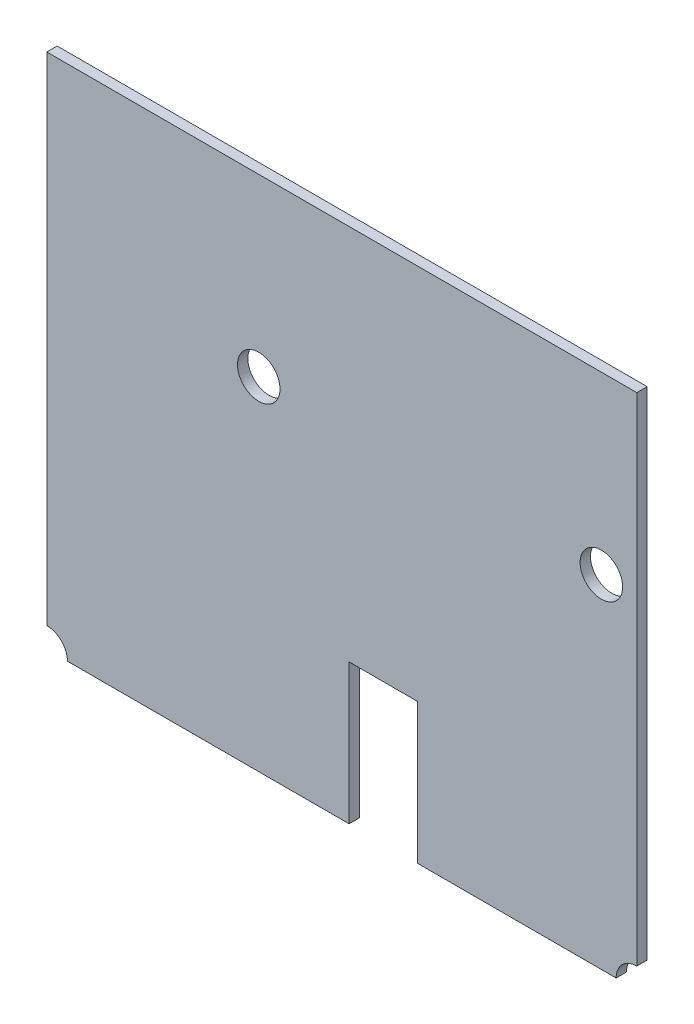
ISO-10303-21;
HEADER;
FILE_DESCRIPTION(('STEP AP214'),'2;1');
FILE_NAME('part.step','',(''),(''),'','','');
FILE_SCHEMA(('AUTOMOTIVE_DESIGN { 1 0 10303 214 1 1 1 1 }'));
ENDSEC;
DATA;
#1=APPLICATION_CONTEXT('core data for automotive mechanical design processes');
#2=APPLICATION_PROTOCOL_DEFINITION('international standard','automotive_design',2000,#1);
#3=PRODUCT_CONTEXT('',#1,'mechanical');
#4=PRODUCT('Part','Part','',(#3));
#5=PRODUCT_RELATED_PRODUCT_CATEGORY('part','',(#4));
#6=PRODUCT_DEFINITION_FORMATION('','',#4);
#7=PRODUCT_DEFINITION_CONTEXT('part definition',#1,'design');
#8=PRODUCT_DEFINITION('design','',#6,#7);
#9=PRODUCT_DEFINITION_SHAPE('','',#8);
#10=(LENGTH_UNIT() NAMED_UNIT(*) SI_UNIT(.MILLI.,.METRE.));
#11=(NAMED_UNIT(*) PLANE_ANGLE_UNIT() SI_UNIT($,.RADIAN.));
#12=(NAMED_UNIT(*) SI_UNIT($,.STERADIAN.) SOLID_ANGLE_UNIT());
#13=UNCERTAINTY_MEASURE_WITH_UNIT(LENGTH_MEASURE(1.E-05),#10,'distance_accuracy_value','');
#14=(GEOMETRIC_REPRESENTATION_CONTEXT(3) GLOBAL_UNCERTAINTY_ASSIGNED_CONTEXT((#13)) GLOBAL_UNIT_ASSIGNED_CONTEXT((#10,
#11,#12)) REPRESENTATION_CONTEXT('',''));
#15=CARTESIAN_POINT('',(0.,0.,0.));
#16=DIRECTION('',(0.,0.,1.));
#17=DIRECTION('',(1.,0.,0.));
#18=AXIS2_PLACEMENT_3D('',#15,#16,#17);
#19=CARTESIAN_POINT('',(2606.04,-2617.90434,1.));
#20=DIRECTION('',(0.,0.,-1.));
#21=DIRECTION('',(-1.,0.,0.));
#22=AXIS2_PLACEMENT_3D('',#19,#20,#21);
#23=PLANE('',#22);
#24=CARTESIAN_POINT('',(2606.04,-2617.90434,1.));
#25=DIRECTION('',(0.,0.,-1.));
#26=DIRECTION('',(-1.,0.,0.));
#27=AXIS2_PLACEMENT_3D('',#24,#25,#26);
#28=CIRCLE('',#27,1.99054720000014);
#29=CARTESIAN_POINT('',(2606.04,-2615.9137928,1.));
#30=VERTEX_POINT('',#29);
#31=CARTESIAN_POINT('',(2608.0305472,-2617.90434,1.));
#32=VERTEX_POINT('',#31);
#33=EDGE_CURVE('E175',#30,#32,#28,.T.);
#34=ORIENTED_EDGE('',*,*,#33,.T.);
#35=DIRECTION('',(1.,0.,0.));
#36=VECTOR('',#35,1.);
#37=CARTESIAN_POINT('',(2608.0305472,-2617.90434,1.));
#38=LINE('',#37,#36);
#39=CARTESIAN_POINT('',(2635.23603,-2617.90434,1.));
#40=VERTEX_POINT('',#39);
#41=EDGE_CURVE('E113',#32,#40,#38,.T.);
#42=ORIENTED_EDGE('',*,*,#41,.T.);
#43=DIRECTION('',(0.,1.,0.));
#44=VECTOR('',#43,1.);
#45=CARTESIAN_POINT('',(2635.23603,-2617.90434,1.));
#46=LINE('',#45,#44);
#47=CARTESIAN_POINT('',(2635.23603,-2604.35979,1.));
#48=VERTEX_POINT('',#47);
#49=EDGE_CURVE('E196',#40,#48,#46,.T.);
#50=ORIENTED_EDGE('',*,*,#49,.T.);
#51=DIRECTION('',(1.,0.,0.));
#52=VECTOR('',#51,1.);
#53=CARTESIAN_POINT('',(2635.23603,-2604.35979,1.));
#54=LINE('',#53,#52);
#55=CARTESIAN_POINT('',(2641.85781,-2604.35979,1.));
#56=VERTEX_POINT('',#55);
#57=EDGE_CURVE('E215',#48,#56,#54,.T.);
#58=ORIENTED_EDGE('',*,*,#57,.T.);
#59=DIRECTION('',(0.,-1.,0.));
#60=VECTOR('',#59,1.);
#61=CARTESIAN_POINT('',(2641.85781,-2604.35979,1.));
#62=LINE('',#61,#60);
#63=CARTESIAN_POINT('',(2641.85781,-2617.90434,1.));
#64=VERTEX_POINT('',#63);
#65=EDGE_CURVE('E212',#56,#64,#62,.T.);
#66=ORIENTED_EDGE('',*,*,#65,.T.);
#67=DIRECTION('',(1.,0.,0.));
#68=VECTOR('',#67,1.);
#69=CARTESIAN_POINT('',(2661.0288664,-2617.90434,1.));
#70=LINE('',#69,#68);
#71=CARTESIAN_POINT('',(2661.0288664,-2617.90434,1.));
#72=VERTEX_POINT('',#71);
#73=EDGE_CURVE('E214',#64,#72,#70,.T.);
#74=ORIENTED_EDGE('',*,*,#73,.T.);
#75=CARTESIAN_POINT('',(2663.02744,-2617.90434,1.));
#76=DIRECTION('',(0.,0.,-1.));
#77=DIRECTION('',(1.,0.,0.));
#78=AXIS2_PLACEMENT_3D('',#75,#76,#77);
#79=CIRCLE('',#78,1.99857359999989);
#80=CARTESIAN_POINT('',(2663.02744,-2615.9057664,1.));
#81=VERTEX_POINT('',#80);
#82=EDGE_CURVE('E138',#72,#81,#79,.T.);
#83=ORIENTED_EDGE('',*,*,#82,.T.);
#84=DIRECTION('',(0.,1.,0.));
#85=VECTOR('',#84,1.);
#86=CARTESIAN_POINT('',(2663.02744,-2615.9057664,1.));
#87=LINE('',#86,#85);
#88=CARTESIAN_POINT('',(2663.02744,-2567.94,1.));
#89=VERTEX_POINT('',#88);
#90=EDGE_CURVE('E132',#81,#89,#87,.T.);
#91=ORIENTED_EDGE('',*,*,#90,.T.);
#92=DIRECTION('',(-1.,0.,0.));
#93=VECTOR('',#92,1.);
#94=CARTESIAN_POINT('',(2663.02744,-2567.94,1.));
#95=LINE('',#94,#93);
#96=CARTESIAN_POINT('',(2606.04,-2567.94,1.));
#97=VERTEX_POINT('',#96);
#98=EDGE_CURVE('E136',#89,#97,#95,.T.);
#99=ORIENTED_EDGE('',*,*,#98,.T.);
#100=DIRECTION('',(0.,-1.,0.));
#101=VECTOR('',#100,1.);
#102=CARTESIAN_POINT('',(2606.04,-2567.94,1.));
#103=LINE('',#102,#101);
#104=EDGE_CURVE('E64',#97,#30,#103,.T.);
#105=ORIENTED_EDGE('',*,*,#104,.T.);
#106=EDGE_LOOP('',(#34,#42,#50,#58,#66,#74,#83,#91,#99,#105));
#107=FACE_BOUND('',#106,.T.);
#108=CARTESIAN_POINT('',(2626.50732,-2584.8749456,1.));
#109=DIRECTION('',(0.,0.,1.));
#110=DIRECTION('',(1.,0.,0.));
#111=AXIS2_PLACEMENT_3D('',#108,#109,#110);
#112=CIRCLE('',#111,2.05400000000036);
#113=CARTESIAN_POINT('',(2628.56132,-2584.8749456,1.));
#114=VERTEX_POINT('',#113);
#115=EDGE_CURVE('E160',#114,#114,#112,.T.);
#116=ORIENTED_EDGE('',*,*,#115,.F.);
#117=EDGE_LOOP('',(#116));
#118=FACE_BOUND('',#117,.T.);
#119=CARTESIAN_POINT('',(2659.60258794856,-2584.87952198987,1.));
#120=DIRECTION('',(0.,0.,1.));
#121=DIRECTION('',(1.,0.,0.));
#122=AXIS2_PLACEMENT_3D('',#119,#120,#121);
#123=CIRCLE('',#122,2.05399999999993);
#124=CARTESIAN_POINT('',(2661.65658794856,-2584.87952198987,1.));
#125=VERTEX_POINT('',#124);
#126=EDGE_CURVE('E226',#125,#125,#123,.T.);
#127=ORIENTED_EDGE('',*,*,#126,.F.);
#128=EDGE_LOOP('',(#127));
#129=FACE_BOUND('',#128,.T.);
#130=ADVANCED_FACE('F47',(#107,#118,#129),#23,.F.);
#131=CARTESIAN_POINT('',(2606.04,-2617.90434,0.));
#132=DIRECTION('',(0.,0.,-1.));
#133=DIRECTION('',(-1.,0.,0.));
#134=AXIS2_PLACEMENT_3D('',#131,#132,#133);
#135=PLANE('',#134);
#136=CARTESIAN_POINT('',(2626.50732,-2584.8749456,0.));
#137=DIRECTION('',(0.,0.,1.));
#138=DIRECTION('',(1.,0.,0.));
#139=AXIS2_PLACEMENT_3D('',#136,#137,#138);
#140=CIRCLE('',#139,2.05400000000036);
#141=CARTESIAN_POINT('',(2628.56132,-2584.8749456,0.));
#142=VERTEX_POINT('',#141);
#143=EDGE_CURVE('E223',#142,#142,#140,.T.);
#144=ORIENTED_EDGE('',*,*,#143,.T.);
#145=EDGE_LOOP('',(#144));
#146=FACE_BOUND('',#145,.T.);
#147=CARTESIAN_POINT('',(2606.04,-2617.90434,0.));
#148=DIRECTION('',(0.,0.,-1.));
#149=DIRECTION('',(-1.,0.,0.));
#150=AXIS2_PLACEMENT_3D('',#147,#148,#149);
#151=CIRCLE('',#150,1.99054720000014);
#152=CARTESIAN_POINT('',(2606.04,-2615.9137928,0.));
#153=VERTEX_POINT('',#152);
#154=CARTESIAN_POINT('',(2608.0305472,-2617.90434,0.));
#155=VERTEX_POINT('',#154);
#156=EDGE_CURVE('E156',#153,#155,#151,.T.);
#157=ORIENTED_EDGE('',*,*,#156,.F.);
#158=DIRECTION('',(0.,-1.,0.));
#159=VECTOR('',#158,1.);
#160=CARTESIAN_POINT('',(2606.04,-2567.94,0.));
#161=LINE('',#160,#159);
#162=CARTESIAN_POINT('',(2606.04,-2567.94,0.));
#163=VERTEX_POINT('',#162);
#164=EDGE_CURVE('E105',#163,#153,#161,.T.);
#165=ORIENTED_EDGE('',*,*,#164,.F.);
#166=DIRECTION('',(-1.,0.,0.));
#167=VECTOR('',#166,1.);
#168=CARTESIAN_POINT('',(2663.02744,-2567.94,0.));
#169=LINE('',#168,#167);
#170=CARTESIAN_POINT('',(2663.02744,-2567.94,0.));
#171=VERTEX_POINT('',#170);
#172=EDGE_CURVE('E99',#171,#163,#169,.T.);
#173=ORIENTED_EDGE('',*,*,#172,.F.);
#174=DIRECTION('',(0.,1.,0.));
#175=VECTOR('',#174,1.);
#176=CARTESIAN_POINT('',(2663.02744,-2615.9057664,0.));
#177=LINE('',#176,#175);
#178=CARTESIAN_POINT('',(2663.02744,-2615.9057664,0.));
#179=VERTEX_POINT('',#178);
#180=EDGE_CURVE('E146',#179,#171,#177,.T.);
#181=ORIENTED_EDGE('',*,*,#180,.F.);
#182=CARTESIAN_POINT('',(2663.02744,-2617.90434,0.));
#183=DIRECTION('',(0.,0.,-1.));
#184=DIRECTION('',(1.,0.,0.));
#185=AXIS2_PLACEMENT_3D('',#182,#183,#184);
#186=CIRCLE('',#185,1.99857359999989);
#187=CARTESIAN_POINT('',(2661.0288664,-2617.90434,0.));
#188=VERTEX_POINT('',#187);
#189=EDGE_CURVE('E170',#188,#179,#186,.T.);
#190=ORIENTED_EDGE('',*,*,#189,.F.);
#191=DIRECTION('',(1.,0.,0.));
#192=VECTOR('',#191,1.);
#193=CARTESIAN_POINT('',(2661.0288664,-2617.90434,0.));
#194=LINE('',#193,#192);
#195=CARTESIAN_POINT('',(2641.85781,-2617.90434,0.));
#196=VERTEX_POINT('',#195);
#197=EDGE_CURVE('E168',#196,#188,#194,.T.);
#198=ORIENTED_EDGE('',*,*,#197,.F.);
#199=DIRECTION('',(0.,-1.,0.));
#200=VECTOR('',#199,1.);
#201=CARTESIAN_POINT('',(2641.85781,-2604.35979,0.));
#202=LINE('',#201,#200);
#203=CARTESIAN_POINT('',(2641.85781,-2604.35979,0.));
#204=VERTEX_POINT('',#203);
#205=EDGE_CURVE('E166',#204,#196,#202,.T.);
#206=ORIENTED_EDGE('',*,*,#205,.F.);
#207=DIRECTION('',(1.,0.,0.));
#208=VECTOR('',#207,1.);
#209=CARTESIAN_POINT('',(2635.23603,-2604.35979,0.));
#210=LINE('',#209,#208);
#211=CARTESIAN_POINT('',(2635.23603,-2604.35979,0.));
#212=VERTEX_POINT('',#211);
#213=EDGE_CURVE('E164',#212,#204,#210,.T.);
#214=ORIENTED_EDGE('',*,*,#213,.F.);
#215=DIRECTION('',(0.,1.,0.));
#216=VECTOR('',#215,1.);
#217=CARTESIAN_POINT('',(2635.23603,-2617.90434,0.));
#218=LINE('',#217,#216);
#219=CARTESIAN_POINT('',(2635.23603,-2617.90434,0.));
#220=VERTEX_POINT('',#219);
#221=EDGE_CURVE('E162',#220,#212,#218,.T.);
#222=ORIENTED_EDGE('',*,*,#221,.F.);
#223=DIRECTION('',(1.,0.,0.));
#224=VECTOR('',#223,1.);
#225=CARTESIAN_POINT('',(2608.0305472,-2617.90434,0.));
#226=LINE('',#225,#224);
#227=EDGE_CURVE('E159',#155,#220,#226,.T.);
#228=ORIENTED_EDGE('',*,*,#227,.F.);
#229=EDGE_LOOP('',(#157,#165,#173,#181,#190,#198,#206,#214,#222,#228));
#230=FACE_BOUND('',#229,.T.);
#231=CARTESIAN_POINT('',(2659.60258794856,-2584.87952198987,0.));
#232=DIRECTION('',(0.,0.,1.));
#233=DIRECTION('',(1.,0.,0.));
#234=AXIS2_PLACEMENT_3D('',#231,#232,#233);
#235=CIRCLE('',#234,2.05399999999993);
#236=CARTESIAN_POINT('',(2661.65658794856,-2584.87952198987,0.));
#237=VERTEX_POINT('',#236);
#238=EDGE_CURVE('E229',#237,#237,#235,.T.);
#239=ORIENTED_EDGE('',*,*,#238,.T.);
#240=EDGE_LOOP('',(#239));
#241=FACE_BOUND('',#240,.T.);
#242=ADVANCED_FACE('F200',(#146,#230,#241),#135,.T.);
#243=CARTESIAN_POINT('',(2606.04,-2617.90434,1.));
#244=DIRECTION('',(0.,0.,-1.));
#245=DIRECTION('',(-1.,0.,0.));
#246=AXIS2_PLACEMENT_3D('',#243,#244,#245);
#247=CYLINDRICAL_SURFACE('',#246,1.99054720000014);
#248=ORIENTED_EDGE('',*,*,#156,.T.);
#249=DIRECTION('',(0.,0.,-1.));
#250=VECTOR('',#249,1.);
#251=CARTESIAN_POINT('',(2608.0305472,-2617.90434,1.));
#252=LINE('',#251,#250);
#253=EDGE_CURVE('E13',#32,#155,#252,.T.);
#254=ORIENTED_EDGE('',*,*,#253,.F.);
#255=ORIENTED_EDGE('',*,*,#33,.F.);
#256=DIRECTION('',(0.,0.,-1.));
#257=VECTOR('',#256,1.);
#258=CARTESIAN_POINT('',(2606.04,-2615.9137928,1.));
#259=LINE('',#258,#257);
#260=EDGE_CURVE('E152',#30,#153,#259,.T.);
#261=ORIENTED_EDGE('',*,*,#260,.T.);
#262=EDGE_LOOP('',(#248,#254,#255,#261));
#263=FACE_BOUND('',#262,.T.);
#264=ADVANCED_FACE('F49',(#263),#247,.F.);
#265=CARTESIAN_POINT('',(2608.0305472,-2617.90434,1.));
#266=DIRECTION('',(0.,1.,0.));
#267=DIRECTION('',(0.,0.,1.));
#268=AXIS2_PLACEMENT_3D('',#265,#266,#267);
#269=PLANE('',#268);
#270=ORIENTED_EDGE('',*,*,#227,.T.);
#271=DIRECTION('',(0.,0.,-1.));
#272=VECTOR('',#271,1.);
#273=CARTESIAN_POINT('',(2635.23603,-2617.90434,1.));
#274=LINE('',#273,#272);
#275=EDGE_CURVE('E56',#40,#220,#274,.T.);
#276=ORIENTED_EDGE('',*,*,#275,.F.);
#277=ORIENTED_EDGE('',*,*,#41,.F.);
#278=ORIENTED_EDGE('',*,*,#253,.T.);
#279=EDGE_LOOP('',(#270,#276,#277,#278));
#280=FACE_BOUND('',#279,.T.);
#281=ADVANCED_FACE('F269',(#280),#269,.F.);
#282=CARTESIAN_POINT('',(2635.23603,-2617.90434,1.));
#283=DIRECTION('',(-1.,0.,0.));
#284=DIRECTION('',(0.,0.,1.));
#285=AXIS2_PLACEMENT_3D('',#282,#283,#284);
#286=PLANE('',#285);
#287=ORIENTED_EDGE('',*,*,#221,.T.);
#288=DIRECTION('',(0.,0.,-1.));
#289=VECTOR('',#288,1.);
#290=CARTESIAN_POINT('',(2635.23603,-2604.35979,1.));
#291=LINE('',#290,#289);
#292=EDGE_CURVE('E188',#48,#212,#291,.T.);
#293=ORIENTED_EDGE('',*,*,#292,.F.);
#294=ORIENTED_EDGE('',*,*,#49,.F.);
#295=ORIENTED_EDGE('',*,*,#275,.T.);
#296=EDGE_LOOP('',(#287,#293,#294,#295));
#297=FACE_BOUND('',#296,.T.);
#298=ADVANCED_FACE('F194',(#297),#286,.F.);
#299=CARTESIAN_POINT('',(2635.23603,-2604.35979,1.));
#300=DIRECTION('',(0.,1.,0.));
#301=DIRECTION('',(0.,0.,1.));
#302=AXIS2_PLACEMENT_3D('',#299,#300,#301);
#303=PLANE('',#302);
#304=ORIENTED_EDGE('',*,*,#213,.T.);
#305=DIRECTION('',(0.,0.,-1.));
#306=VECTOR('',#305,1.);
#307=CARTESIAN_POINT('',(2641.85781,-2604.35979,1.));
#308=LINE('',#307,#306);
#309=EDGE_CURVE('E185',#56,#204,#308,.T.);
#310=ORIENTED_EDGE('',*,*,#309,.F.);
#311=ORIENTED_EDGE('',*,*,#57,.F.);
#312=ORIENTED_EDGE('',*,*,#292,.T.);
#313=EDGE_LOOP('',(#304,#310,#311,#312));
#314=FACE_BOUND('',#313,.T.);
#315=ADVANCED_FACE('F206',(#314),#303,.F.);
#316=CARTESIAN_POINT('',(2641.85781,-2604.35979,1.));
#317=DIRECTION('',(1.,0.,0.));
#318=DIRECTION('',(0.,0.,-1.));
#319=AXIS2_PLACEMENT_3D('',#316,#317,#318);
#320=PLANE('',#319);
#321=ORIENTED_EDGE('',*,*,#205,.T.);
#322=DIRECTION('',(0.,0.,-1.));
#323=VECTOR('',#322,1.);
#324=CARTESIAN_POINT('',(2641.85781,-2617.90434,1.));
#325=LINE('',#324,#323);
#326=EDGE_CURVE('E182',#64,#196,#325,.T.);
#327=ORIENTED_EDGE('',*,*,#326,.F.);
#328=ORIENTED_EDGE('',*,*,#65,.F.);
#329=ORIENTED_EDGE('',*,*,#309,.T.);
#330=EDGE_LOOP('',(#321,#327,#328,#329));
#331=FACE_BOUND('',#330,.T.);
#332=ADVANCED_FACE('F210',(#331),#320,.F.);
#333=CARTESIAN_POINT('',(2661.0288664,-2617.90434,1.));
#334=DIRECTION('',(0.,1.,0.));
#335=DIRECTION('',(0.,0.,1.));
#336=AXIS2_PLACEMENT_3D('',#333,#334,#335);
#337=PLANE('',#336);
#338=ORIENTED_EDGE('',*,*,#197,.T.);
#339=DIRECTION('',(0.,0.,-1.));
#340=VECTOR('',#339,1.);
#341=CARTESIAN_POINT('',(2661.0288664,-2617.90434,1.));
#342=LINE('',#341,#340);
#343=EDGE_CURVE('E179',#72,#188,#342,.T.);
#344=ORIENTED_EDGE('',*,*,#343,.F.);
#345=ORIENTED_EDGE('',*,*,#73,.F.);
#346=ORIENTED_EDGE('',*,*,#326,.T.);
#347=EDGE_LOOP('',(#338,#344,#345,#346));
#348=FACE_BOUND('',#347,.T.);
#349=ADVANCED_FACE('F259',(#348),#337,.F.);
#350=CARTESIAN_POINT('',(2663.02744,-2617.90434,1.));
#351=DIRECTION('',(0.,0.,-1.));
#352=DIRECTION('',(-1.,0.,0.));
#353=AXIS2_PLACEMENT_3D('',#350,#351,#352);
#354=CYLINDRICAL_SURFACE('',#353,1.99857359999989);
#355=ORIENTED_EDGE('',*,*,#189,.T.);
#356=DIRECTION('',(0.,0.,-1.));
#357=VECTOR('',#356,1.);
#358=CARTESIAN_POINT('',(2663.02744,-2615.9057664,1.));
#359=LINE('',#358,#357);
#360=EDGE_CURVE('E147',#81,#179,#359,.T.);
#361=ORIENTED_EDGE('',*,*,#360,.F.);
#362=ORIENTED_EDGE('',*,*,#82,.F.);
#363=ORIENTED_EDGE('',*,*,#343,.T.);
#364=EDGE_LOOP('',(#355,#361,#362,#363));
#365=FACE_BOUND('',#364,.T.);
#366=ADVANCED_FACE('F256',(#365),#354,.F.);
#367=CARTESIAN_POINT('',(2663.02744,-2615.9057664,1.));
#368=DIRECTION('',(-1.,0.,0.));
#369=DIRECTION('',(0.,0.,1.));
#370=AXIS2_PLACEMENT_3D('',#367,#368,#369);
#371=PLANE('',#370);
#372=ORIENTED_EDGE('',*,*,#180,.T.);
#373=DIRECTION('',(0.,0.,-1.));
#374=VECTOR('',#373,1.);
#375=CARTESIAN_POINT('',(2663.02744,-2567.94,1.));
#376=LINE('',#375,#374);
#377=EDGE_CURVE('E143',#89,#171,#376,.T.);
#378=ORIENTED_EDGE('',*,*,#377,.F.);
#379=ORIENTED_EDGE('',*,*,#90,.F.);
#380=ORIENTED_EDGE('',*,*,#360,.T.);
#381=EDGE_LOOP('',(#372,#378,#379,#380));
#382=FACE_BOUND('',#381,.T.);
#383=ADVANCED_FACE('F144',(#382),#371,.F.);
#384=CARTESIAN_POINT('',(2663.02744,-2567.94,1.));
#385=DIRECTION('',(0.,-1.,0.));
#386=DIRECTION('',(0.,0.,-1.));
#387=AXIS2_PLACEMENT_3D('',#384,#385,#386);
#388=PLANE('',#387);
#389=ORIENTED_EDGE('',*,*,#172,.T.);
#390=DIRECTION('',(0.,0.,-1.));
#391=VECTOR('',#390,1.);
#392=CARTESIAN_POINT('',(2606.04,-2567.94,1.));
#393=LINE('',#392,#391);
#394=EDGE_CURVE('E148',#97,#163,#393,.T.);
#395=ORIENTED_EDGE('',*,*,#394,.F.);
#396=ORIENTED_EDGE('',*,*,#98,.F.);
#397=ORIENTED_EDGE('',*,*,#377,.T.);
#398=EDGE_LOOP('',(#389,#395,#396,#397));
#399=FACE_BOUND('',#398,.T.);
#400=ADVANCED_FACE('F150',(#399),#388,.F.);
#401=CARTESIAN_POINT('',(2606.04,-2567.94,1.));
#402=DIRECTION('',(1.,0.,0.));
#403=DIRECTION('',(0.,0.,-1.));
#404=AXIS2_PLACEMENT_3D('',#401,#402,#403);
#405=PLANE('',#404);
#406=ORIENTED_EDGE('',*,*,#164,.T.);
#407=ORIENTED_EDGE('',*,*,#260,.F.);
#408=ORIENTED_EDGE('',*,*,#104,.F.);
#409=ORIENTED_EDGE('',*,*,#394,.T.);
#410=EDGE_LOOP('',(#406,#407,#408,#409));
#411=FACE_BOUND('',#410,.T.);
#412=ADVANCED_FACE('F249',(#411),#405,.F.);
#413=CARTESIAN_POINT('',(2626.50732,-2584.8749456,1.));
#414=DIRECTION('',(0.,0.,-1.));
#415=DIRECTION('',(-1.,0.,0.));
#416=AXIS2_PLACEMENT_3D('',#413,#414,#415);
#417=CYLINDRICAL_SURFACE('',#416,2.05400000000036);
#418=ORIENTED_EDGE('',*,*,#115,.T.);
#419=EDGE_LOOP('',(#418));
#420=FACE_BOUND('',#419,.T.);
#421=ORIENTED_EDGE('',*,*,#143,.F.);
#422=EDGE_LOOP('',(#421));
#423=FACE_BOUND('',#422,.T.);
#424=ADVANCED_FACE('F246',(#420,#423),#417,.F.);
#425=CARTESIAN_POINT('',(2659.60258794856,-2584.87952198987,1.));
#426=DIRECTION('',(0.,0.,-1.));
#427=DIRECTION('',(-1.,0.,0.));
#428=AXIS2_PLACEMENT_3D('',#425,#426,#427);
#429=CYLINDRICAL_SURFACE('',#428,2.05399999999993);
#430=ORIENTED_EDGE('',*,*,#126,.T.);
#431=EDGE_LOOP('',(#430));
#432=FACE_BOUND('',#431,.T.);
#433=ORIENTED_EDGE('',*,*,#238,.F.);
#434=EDGE_LOOP('',(#433));
#435=FACE_BOUND('',#434,.T.);
#436=ADVANCED_FACE('F235',(#432,#435),#429,.F.);
#437=CLOSED_SHELL('',(#130,#242,#264,#281,#298,#315,#332,#349,#366,#383,#400,#412,#424,#436));
#438=MANIFOLD_SOLID_BREP('B2',#437);
#439=ADVANCED_BREP_SHAPE_REPRESENTATION('',(#18,#438),#14);
#440=SHAPE_DEFINITION_REPRESENTATION(#9,#439);
ENDSEC;
END-ISO-10303-21;
